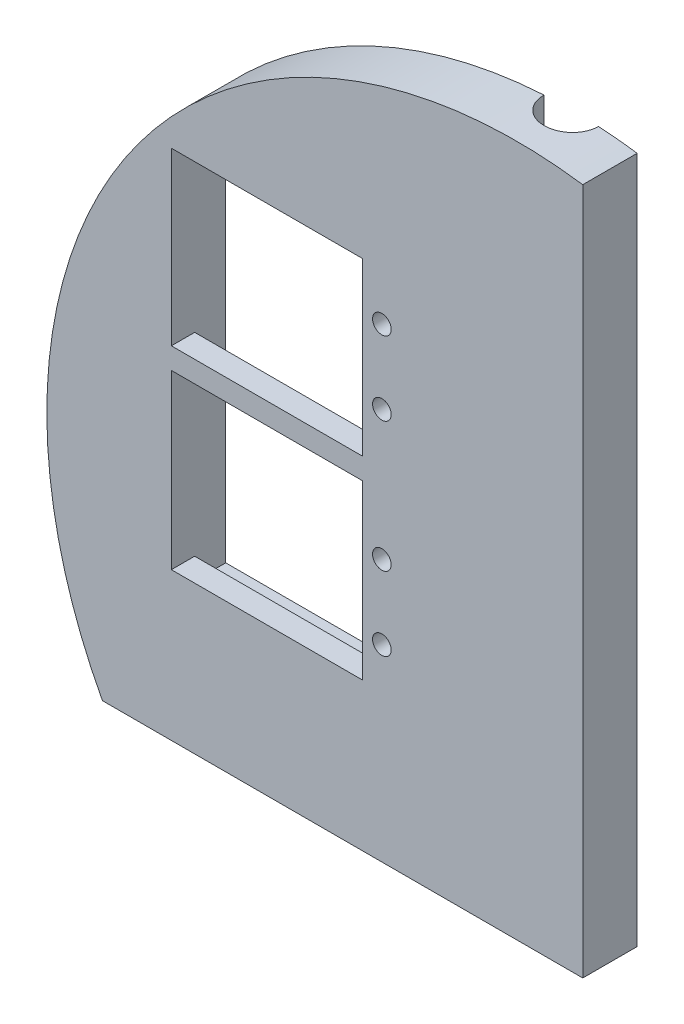
ISO-10303-21;
HEADER;
FILE_DESCRIPTION(('STEP AP214'),'2;1');
FILE_NAME('part.step','',(''),(''),'','','');
FILE_SCHEMA(('AUTOMOTIVE_DESIGN { 1 0 10303 214 1 1 1 1 }'));
ENDSEC;
DATA;
#1=APPLICATION_CONTEXT('core data for automotive mechanical design processes');
#2=APPLICATION_PROTOCOL_DEFINITION('international standard','automotive_design',2000,#1);
#3=PRODUCT_CONTEXT('',#1,'mechanical');
#4=PRODUCT('Part','Part','',(#3));
#5=PRODUCT_RELATED_PRODUCT_CATEGORY('part','',(#4));
#6=PRODUCT_DEFINITION_FORMATION('','',#4);
#7=PRODUCT_DEFINITION_CONTEXT('part definition',#1,'design');
#8=PRODUCT_DEFINITION('design','',#6,#7);
#9=PRODUCT_DEFINITION_SHAPE('','',#8);
#10=(LENGTH_UNIT() NAMED_UNIT(*) SI_UNIT(.MILLI.,.METRE.));
#11=(NAMED_UNIT(*) PLANE_ANGLE_UNIT() SI_UNIT($,.RADIAN.));
#12=(NAMED_UNIT(*) SI_UNIT($,.STERADIAN.) SOLID_ANGLE_UNIT());
#13=UNCERTAINTY_MEASURE_WITH_UNIT(LENGTH_MEASURE(1.E-05),#10,'distance_accuracy_value','');
#14=(GEOMETRIC_REPRESENTATION_CONTEXT(3) GLOBAL_UNCERTAINTY_ASSIGNED_CONTEXT((#13)) GLOBAL_UNIT_ASSIGNED_CONTEXT((#10,
#11,#12)) REPRESENTATION_CONTEXT('',''));
#15=CARTESIAN_POINT('',(0.,0.,0.));
#16=DIRECTION('',(0.,0.,1.));
#17=DIRECTION('',(1.,0.,0.));
#18=AXIS2_PLACEMENT_3D('',#15,#16,#17);
#19=CARTESIAN_POINT('',(0.,0.,0.));
#20=DIRECTION('',(0.,0.,1.));
#21=DIRECTION('',(1.,0.,0.));
#22=AXIS2_PLACEMENT_3D('',#19,#20,#21);
#23=PLANE('',#22);
#24=DIRECTION('',(-1.,0.,0.));
#25=VECTOR('',#24,1.);
#26=CARTESIAN_POINT('',(0.,-17.2383494563795,0.));
#27=LINE('',#26,#25);
#28=CARTESIAN_POINT('',(4.49999999999929,-17.2383494563795,0.));
#29=VERTEX_POINT('',#28);
#30=CARTESIAN_POINT('',(2.50000000000061,-17.2383494563795,0.));
#31=VERTEX_POINT('',#30);
#32=EDGE_CURVE('E360',#29,#31,#27,.T.);
#33=ORIENTED_EDGE('',*,*,#32,.F.);
#34=DIRECTION('',(0.,1.,0.));
#35=VECTOR('',#34,1.);
#36=CARTESIAN_POINT('',(4.49999999999929,-17.2383494563795,0.));
#37=LINE('',#36,#35);
#38=CARTESIAN_POINT('',(4.49999999999929,-14.2383494563795,0.));
#39=VERTEX_POINT('',#38);
#40=EDGE_CURVE('E64',#29,#39,#37,.T.);
#41=ORIENTED_EDGE('',*,*,#40,.T.);
#42=DIRECTION('',(-1.,0.,0.));
#43=VECTOR('',#42,1.);
#44=CARTESIAN_POINT('',(0.,-14.2383494563795,0.));
#45=LINE('',#44,#43);
#46=CARTESIAN_POINT('',(2.50000000000061,-14.2383494563795,0.));
#47=VERTEX_POINT('',#46);
#48=EDGE_CURVE('E353',#39,#47,#45,.T.);
#49=ORIENTED_EDGE('',*,*,#48,.T.);
#50=DIRECTION('',(0.,1.,0.));
#51=VECTOR('',#50,1.);
#52=CARTESIAN_POINT('',(2.50000000000061,-22.5,0.));
#53=LINE('',#52,#51);
#54=CARTESIAN_POINT('',(2.50000000000061,-9.50000000000001,0.));
#55=VERTEX_POINT('',#54);
#56=EDGE_CURVE('E388',#47,#55,#53,.T.);
#57=ORIENTED_EDGE('',*,*,#56,.T.);
#58=DIRECTION('',(-1.,0.,0.));
#59=VECTOR('',#58,1.);
#60=CARTESIAN_POINT('',(0.,-9.50000000000001,0.));
#61=LINE('',#60,#59);
#62=CARTESIAN_POINT('',(3.50000000003442,-9.50000000000001,0.));
#63=VERTEX_POINT('',#62);
#64=EDGE_CURVE('E283',#63,#55,#61,.T.);
#65=ORIENTED_EDGE('',*,*,#64,.F.);
#66=DIRECTION('',(0.,1.,0.));
#67=VECTOR('',#66,1.);
#68=CARTESIAN_POINT('',(3.50000000003442,-9.50000000000001,0.));
#69=LINE('',#68,#67);
#70=CARTESIAN_POINT('',(3.50000000003442,60.398675482164,0.));
#71=VERTEX_POINT('',#70);
#72=EDGE_CURVE('E299',#63,#71,#69,.T.);
#73=ORIENTED_EDGE('',*,*,#72,.T.);
#74=CARTESIAN_POINT('',(0.,0.,0.));
#75=DIRECTION('',(0.,0.,1.));
#76=DIRECTION('',(1.,0.,0.));
#77=AXIS2_PLACEMENT_3D('',#74,#75,#76);
#78=CIRCLE('',#77,60.5);
#79=CARTESIAN_POINT('',(8.48784603441241,59.9016399583193,0.));
#80=VERTEX_POINT('',#79);
#81=EDGE_CURVE('E277',#80,#71,#78,.T.);
#82=ORIENTED_EDGE('',*,*,#81,.F.);
#83=DIRECTION('',(0.,-1.,0.));
#84=VECTOR('',#83,1.);
#85=CARTESIAN_POINT('',(8.48784603441242,0.,0.));
#86=LINE('',#85,#84);
#87=CARTESIAN_POINT('',(8.48784603441242,-28.5421058613369,0.));
#88=VERTEX_POINT('',#87);
#89=EDGE_CURVE('E301',#80,#88,#86,.T.);
#90=ORIENTED_EDGE('',*,*,#89,.T.);
#91=DIRECTION('',(-1.,0.,0.));
#92=VECTOR('',#91,1.);
#93=CARTESIAN_POINT('',(0.,-28.5421058613369,0.));
#94=LINE('',#93,#92);
#95=CARTESIAN_POINT('',(-53.3441486294443,-28.5421058613369,0.));
#96=VERTEX_POINT('',#95);
#97=EDGE_CURVE('E304',#88,#96,#94,.T.);
#98=ORIENTED_EDGE('',*,*,#97,.T.);
#99=CARTESIAN_POINT('',(-3.49999999996558,60.398675482168,0.));
#100=VERTEX_POINT('',#99);
#101=EDGE_CURVE('E289',#100,#96,#78,.T.);
#102=ORIENTED_EDGE('',*,*,#101,.F.);
#103=DIRECTION('',(0.,1.,0.));
#104=VECTOR('',#103,1.);
#105=CARTESIAN_POINT('',(-3.49999999996558,-9.50000000000001,0.));
#106=LINE('',#105,#104);
#107=CARTESIAN_POINT('',(-3.49999999996558,37.4902757720887,0.));
#108=VERTEX_POINT('',#107);
#109=EDGE_CURVE('E294',#100,#108,#106,.F.);
#110=ORIENTED_EDGE('',*,*,#109,.T.);
#111=DIRECTION('',(1.,0.,0.));
#112=VECTOR('',#111,1.);
#113=CARTESIAN_POINT('',(-2.,37.4902757720887,0.));
#114=LINE('',#113,#112);
#115=CARTESIAN_POINT('',(-44.4723778560623,37.4902757720887,0.));
#116=VERTEX_POINT('',#115);
#117=EDGE_CURVE('E506',#116,#108,#114,.T.);
#118=ORIENTED_EDGE('',*,*,#117,.F.);
#119=DIRECTION('',(0.,1.,0.));
#120=VECTOR('',#119,1.);
#121=CARTESIAN_POINT('',(-44.4723778560623,37.4902757720887,0.));
#122=LINE('',#121,#120);
#123=CARTESIAN_POINT('',(-44.4723778560623,-12.2383494563795,0.));
#124=VERTEX_POINT('',#123);
#125=EDGE_CURVE('E492',#124,#116,#122,.T.);
#126=ORIENTED_EDGE('',*,*,#125,.F.);
#127=DIRECTION('',(-1.,0.,0.));
#128=VECTOR('',#127,1.);
#129=CARTESIAN_POINT('',(-44.4723778560623,-12.2383494563795,0.));
#130=LINE('',#129,#128);
#131=CARTESIAN_POINT('',(-2.50000000000045,-12.2383494563795,0.));
#132=VERTEX_POINT('',#131);
#133=EDGE_CURVE('E511',#132,#124,#130,.T.);
#134=ORIENTED_EDGE('',*,*,#133,.F.);
#135=DIRECTION('',(0.,1.,0.));
#136=VECTOR('',#135,1.);
#137=CARTESIAN_POINT('',(-2.50000000000045,-22.5,0.));
#138=LINE('',#137,#136);
#139=CARTESIAN_POINT('',(-2.50000000000045,-14.2383494563795,0.));
#140=VERTEX_POINT('',#139);
#141=EDGE_CURVE('E226',#132,#140,#138,.F.);
#142=ORIENTED_EDGE('',*,*,#141,.T.);
#143=CARTESIAN_POINT('',(-4.50000000000002,-14.2383494563795,0.));
#144=VERTEX_POINT('',#143);
#145=EDGE_CURVE('E73',#140,#144,#45,.T.);
#146=ORIENTED_EDGE('',*,*,#145,.T.);
#147=DIRECTION('',(0.,1.,0.));
#148=VECTOR('',#147,1.);
#149=CARTESIAN_POINT('',(-4.50000000000002,-17.2383494563795,0.));
#150=LINE('',#149,#148);
#151=CARTESIAN_POINT('',(-4.50000000000002,-17.2383494563795,0.));
#152=VERTEX_POINT('',#151);
#153=EDGE_CURVE('E350',#144,#152,#150,.F.);
#154=ORIENTED_EDGE('',*,*,#153,.T.);
#155=CARTESIAN_POINT('',(-2.50000000000045,-17.2383494563795,0.));
#156=VERTEX_POINT('',#155);
#157=EDGE_CURVE('E368',#156,#152,#27,.T.);
#158=ORIENTED_EDGE('',*,*,#157,.F.);
#159=CARTESIAN_POINT('',(-2.50000000000045,-22.5,0.));
#160=VERTEX_POINT('',#159);
#161=EDGE_CURVE('E381',#156,#160,#138,.F.);
#162=ORIENTED_EDGE('',*,*,#161,.T.);
#163=DIRECTION('',(-1.,0.,0.));
#164=VECTOR('',#163,1.);
#165=CARTESIAN_POINT('',(0.,-22.5,0.));
#166=LINE('',#165,#164);
#167=CARTESIAN_POINT('',(2.50000000000061,-22.5,0.));
#168=VERTEX_POINT('',#167);
#169=EDGE_CURVE('E227',#168,#160,#166,.T.);
#170=ORIENTED_EDGE('',*,*,#169,.F.);
#171=EDGE_CURVE('E387',#168,#31,#53,.T.);
#172=ORIENTED_EDGE('',*,*,#171,.T.);
#173=EDGE_LOOP('',(#33,#41,#49,#57,#65,#73,#82,#90,#98,#102,#110,#118,#126,#134,#142,#146,#154,
#158,#162,#170,#172));
#174=FACE_BOUND('',#173,.T.);
#175=ADVANCED_FACE('F51',(#174),#23,.F.);
#176=CARTESIAN_POINT('',(0.,-22.5,0.));
#177=DIRECTION('',(0.,1.,0.));
#178=DIRECTION('',(0.,0.,1.));
#179=AXIS2_PLACEMENT_3D('',#176,#177,#178);
#180=CYLINDRICAL_SURFACE('',#179,2.50000000000053);
#181=CARTESIAN_POINT('',(0.,-17.2383494563795,0.));
#182=DIRECTION('',(0.,1.,0.));
#183=DIRECTION('',(0.,0.,1.));
#184=AXIS2_PLACEMENT_3D('',#181,#182,#183);
#185=CIRCLE('',#184,2.50000000000053);
#186=EDGE_CURVE('E342',#31,#156,#185,.F.);
#187=ORIENTED_EDGE('',*,*,#186,.F.);
#188=ORIENTED_EDGE('',*,*,#171,.F.);
#189=CARTESIAN_POINT('',(0.,-22.5,0.));
#190=DIRECTION('',(0.,1.,0.));
#191=DIRECTION('',(0.,0.,1.));
#192=AXIS2_PLACEMENT_3D('',#189,#190,#191);
#193=CIRCLE('',#192,2.50000000000053);
#194=EDGE_CURVE('E378',#160,#168,#193,.T.);
#195=ORIENTED_EDGE('',*,*,#194,.F.);
#196=ORIENTED_EDGE('',*,*,#161,.F.);
#197=EDGE_LOOP('',(#187,#188,#195,#196));
#198=FACE_BOUND('',#197,.T.);
#199=ADVANCED_FACE('F250',(#198),#180,.F.);
#200=CARTESIAN_POINT('',(0.,0.,4.));
#201=DIRECTION('',(0.,0.,1.));
#202=DIRECTION('',(1.,0.,0.));
#203=AXIS2_PLACEMENT_3D('',#200,#201,#202);
#204=PLANE('',#203);
#205=CARTESIAN_POINT('',(-17.373644116037,-4.3075310000471,4.));
#206=DIRECTION('',(0.,0.,-1.));
#207=DIRECTION('',(-1.,0.,0.));
#208=AXIS2_PLACEMENT_3D('',#205,#206,#207);
#209=CIRCLE('',#208,2.2);
#210=CARTESIAN_POINT('',(-19.573644116037,-4.3075310000471,4.));
#211=VERTEX_POINT('',#210);
#212=EDGE_CURVE('E436',#211,#211,#209,.T.);
#213=ORIENTED_EDGE('',*,*,#212,.F.);
#214=EDGE_LOOP('',(#213));
#215=FACE_BOUND('',#214,.T.);
#216=CARTESIAN_POINT('',(-17.3776969994148,5.19246813543373,4.));
#217=DIRECTION('',(0.,0.,-1.));
#218=DIRECTION('',(-1.,0.,0.));
#219=AXIS2_PLACEMENT_3D('',#216,#217,#218);
#220=CIRCLE('',#219,2.2);
#221=CARTESIAN_POINT('',(-19.5776969994148,5.19246813543373,4.));
#222=VERTEX_POINT('',#221);
#223=EDGE_CURVE('E446',#222,#222,#220,.T.);
#224=ORIENTED_EDGE('',*,*,#223,.F.);
#225=EDGE_LOOP('',(#224));
#226=FACE_BOUND('',#225,.T.);
#227=CARTESIAN_POINT('',(-17.371512218157,21.9269050735277,4.));
#228=DIRECTION('',(0.,0.,-1.));
#229=DIRECTION('',(-1.,0.,0.));
#230=AXIS2_PLACEMENT_3D('',#227,#228,#229);
#231=CIRCLE('',#230,2.2);
#232=CARTESIAN_POINT('',(-19.571512218157,21.9269050735277,4.));
#233=VERTEX_POINT('',#232);
#234=EDGE_CURVE('E464',#233,#233,#231,.T.);
#235=ORIENTED_EDGE('',*,*,#234,.F.);
#236=EDGE_LOOP('',(#235));
#237=FACE_BOUND('',#236,.T.);
#238=CARTESIAN_POINT('',(-17.371512218157,31.4269050735276,4.));
#239=DIRECTION('',(0.,0.,-1.));
#240=DIRECTION('',(-1.,0.,0.));
#241=AXIS2_PLACEMENT_3D('',#238,#239,#240);
#242=CIRCLE('',#241,2.2);
#243=CARTESIAN_POINT('',(-19.571512218157,31.4269050735276,4.));
#244=VERTEX_POINT('',#243);
#245=EDGE_CURVE('E475',#244,#244,#242,.T.);
#246=ORIENTED_EDGE('',*,*,#245,.F.);
#247=EDGE_LOOP('',(#246));
#248=FACE_BOUND('',#247,.T.);
#249=DIRECTION('',(0.,-1.,0.));
#250=VECTOR('',#249,1.);
#251=CARTESIAN_POINT('',(-19.8820759993379,15.4563544375841,4.));
#252=LINE('',#251,#250);
#253=CARTESIAN_POINT('',(-19.8820759993379,37.4902757720887,4.));
#254=VERTEX_POINT('',#253);
#255=CARTESIAN_POINT('',(-19.8820759993379,15.4563544375841,4.));
#256=VERTEX_POINT('',#255);
#257=EDGE_CURVE('E393',#254,#256,#252,.T.);
#258=ORIENTED_EDGE('',*,*,#257,.F.);
#259=DIRECTION('',(1.,0.,0.));
#260=VECTOR('',#259,1.);
#261=CARTESIAN_POINT('',(-2.,37.4902757720887,4.));
#262=LINE('',#261,#260);
#263=CARTESIAN_POINT('',(-1.,37.4902757720887,4.));
#264=VERTEX_POINT('',#263);
#265=EDGE_CURVE('E497',#254,#264,#262,.T.);
#266=ORIENTED_EDGE('',*,*,#265,.T.);
#267=DIRECTION('',(0.,1.,0.));
#268=VECTOR('',#267,1.);
#269=CARTESIAN_POINT('',(-1.,37.4902757720887,4.));
#270=LINE('',#269,#268);
#271=CARTESIAN_POINT('',(-1.,-12.2383494563795,4.));
#272=VERTEX_POINT('',#271);
#273=EDGE_CURVE('E218',#272,#264,#270,.T.);
#274=ORIENTED_EDGE('',*,*,#273,.F.);
#275=DIRECTION('',(-1.,0.,0.));
#276=VECTOR('',#275,1.);
#277=CARTESIAN_POINT('',(-44.4723778560623,-12.2383494563795,4.));
#278=LINE('',#277,#276);
#279=CARTESIAN_POINT('',(-44.4723778560623,-12.2383494563795,4.));
#280=VERTEX_POINT('',#279);
#281=EDGE_CURVE('E212',#272,#280,#278,.T.);
#282=ORIENTED_EDGE('',*,*,#281,.T.);
#283=DIRECTION('',(0.,1.,0.));
#284=VECTOR('',#283,1.);
#285=CARTESIAN_POINT('',(-44.4723778560623,37.4902757720887,4.));
#286=LINE('',#285,#284);
#287=CARTESIAN_POINT('',(-44.4723778560623,-9.500807520189,4.));
#288=VERTEX_POINT('',#287);
#289=EDGE_CURVE('E494',#280,#288,#286,.T.);
#290=ORIENTED_EDGE('',*,*,#289,.T.);
#291=DIRECTION('',(-1.,0.,0.));
#292=VECTOR('',#291,1.);
#293=CARTESIAN_POINT('',(-44.4723778560623,-9.500807520189,4.));
#294=LINE('',#293,#292);
#295=CARTESIAN_POINT('',(-19.8715107920174,-9.500807520189,4.));
#296=VERTEX_POINT('',#295);
#297=EDGE_CURVE('E427',#296,#288,#294,.T.);
#298=ORIENTED_EDGE('',*,*,#297,.F.);
#299=DIRECTION('',(0.000475599259911524,-0.999999886902666,0.));
#300=VECTOR('',#299,1.);
#301=CARTESIAN_POINT('',(-19.8715107920174,-9.500807520189,4.));
#302=LINE('',#301,#300);
#303=CARTESIAN_POINT('',(-19.8820759993379,12.7137058656536,4.));
#304=VERTEX_POINT('',#303);
#305=EDGE_CURVE('E400',#304,#296,#302,.T.);
#306=ORIENTED_EDGE('',*,*,#305,.F.);
#307=DIRECTION('',(1.,0.,0.));
#308=VECTOR('',#307,1.);
#309=CARTESIAN_POINT('',(-19.8820759993379,12.7137058656536,4.));
#310=LINE('',#309,#308);
#311=CARTESIAN_POINT('',(-44.4723778560623,12.7137058656536,4.));
#312=VERTEX_POINT('',#311);
#313=EDGE_CURVE('E416',#312,#304,#310,.T.);
#314=ORIENTED_EDGE('',*,*,#313,.F.);
#315=CARTESIAN_POINT('',(-44.4723778560623,15.4563544375841,4.));
#316=VERTEX_POINT('',#315);
#317=EDGE_CURVE('E499',#312,#316,#286,.T.);
#318=ORIENTED_EDGE('',*,*,#317,.T.);
#319=DIRECTION('',(-1.,0.,0.));
#320=VECTOR('',#319,1.);
#321=CARTESIAN_POINT('',(-44.4723778560623,15.4563544375841,4.));
#322=LINE('',#321,#320);
#323=EDGE_CURVE('E399',#256,#316,#322,.T.);
#324=ORIENTED_EDGE('',*,*,#323,.F.);
#325=EDGE_LOOP('',(#258,#266,#274,#282,#290,#298,#306,#314,#318,#324));
#326=FACE_BOUND('',#325,.T.);
#327=ADVANCED_FACE('F252',(#215,#226,#237,#248,#326),#204,.F.);
#328=CARTESIAN_POINT('',(0.,0.,7.));
#329=DIRECTION('',(0.,0.,-1.));
#330=DIRECTION('',(-1.,0.,0.));
#331=AXIS2_PLACEMENT_3D('',#328,#329,#330);
#332=CYLINDRICAL_SURFACE('',#331,60.5);
#333=ORIENTED_EDGE('',*,*,#101,.T.);
#334=DIRECTION('',(0.,0.,1.));
#335=VECTOR('',#334,1.);
#336=CARTESIAN_POINT('',(-53.3441486294443,-28.5421058613369,-3.));
#337=LINE('',#336,#335);
#338=CARTESIAN_POINT('',(-53.3441486294443,-28.5421058613369,7.));
#339=VERTEX_POINT('',#338);
#340=EDGE_CURVE('E528',#96,#339,#337,.T.);
#341=ORIENTED_EDGE('',*,*,#340,.T.);
#342=CARTESIAN_POINT('',(0.,0.,7.));
#343=DIRECTION('',(0.,0.,1.));
#344=DIRECTION('',(1.,0.,0.));
#345=AXIS2_PLACEMENT_3D('',#342,#343,#344);
#346=CIRCLE('',#345,60.5);
#347=CARTESIAN_POINT('',(8.48784603441241,59.9016399583193,7.));
#348=VERTEX_POINT('',#347);
#349=EDGE_CURVE('E282',#348,#339,#346,.T.);
#350=ORIENTED_EDGE('',*,*,#349,.F.);
#351=DIRECTION('',(0.,0.,1.));
#352=VECTOR('',#351,1.);
#353=CARTESIAN_POINT('',(8.48784603441241,59.9016399583193,-3.));
#354=LINE('',#353,#352);
#355=EDGE_CURVE('E527',#80,#348,#354,.T.);
#356=ORIENTED_EDGE('',*,*,#355,.F.);
#357=ORIENTED_EDGE('',*,*,#81,.T.);
#358=CARTESIAN_POINT('',(3.50000000003442,60.398675482164,0.));
#359=CARTESIAN_POINT('',(3.50000952693264,60.398673138297,0.0983527657712839));
#360=CARTESIAN_POINT('',(3.49585435544842,60.3989156684955,0.196700946772377));
#361=CARTESIAN_POINT('',(3.47928835721452,60.3998731671281,0.392692080631501));
#362=CARTESIAN_POINT('',(3.46687797670895,60.4005881100253,0.490335071320959));
#363=CARTESIAN_POINT('',(3.43388790216585,60.4024724071079,0.684156432208212));
#364=CARTESIAN_POINT('',(3.41331446072073,60.4036414134836,0.780335865023678));
#365=CARTESIAN_POINT('',(3.36416643400679,60.4063985365345,0.970593237529522));
#366=CARTESIAN_POINT('',(3.33559193558346,60.4079866486607,1.06467120001783));
#367=CARTESIAN_POINT('',(3.23810185102494,60.4133180889932,1.34284085923981));
#368=CARTESIAN_POINT('',(3.1574052385381,60.4176293982524,1.52295268028292));
#369=CARTESIAN_POINT('',(2.96702667085545,60.4272767162173,1.86693430382375));
#370=CARTESIAN_POINT('',(2.85735094592784,60.4326125046013,2.03080758707166));
#371=CARTESIAN_POINT('',(2.61196050746828,60.4437153357395,2.33801745158537));
#372=CARTESIAN_POINT('',(2.47622057303447,60.4494827928702,2.48133390454184));
#373=CARTESIAN_POINT('',(2.18255455108583,60.4607972262713,2.74320572601958));
#374=CARTESIAN_POINT('',(2.02462004625511,60.4663441178633,2.86175165767552));
#375=CARTESIAN_POINT('',(1.69090577353212,60.4765964279645,3.07077461339094));
#376=CARTESIAN_POINT('',(1.51510667155134,60.4813009192443,3.16122078755021));
#377=CARTESIAN_POINT('',(1.15092283784931,60.4893248003223,3.31120432193968));
#378=CARTESIAN_POINT('',(0.962553025279566,60.492645799313,3.3707776113962));
#379=CARTESIAN_POINT('',(0.644288181579025,60.4967019541037,3.44263116568296));
#380=CARTESIAN_POINT('',(0.516401641595087,60.4979329159732,3.46411532160443));
#381=CARTESIAN_POINT('',(0.25902882531931,60.4995823791425,3.49280264476635));
#382=CARTESIAN_POINT('',(0.129542517910183,60.5000008646136,3.50000553377854));
#383=CARTESIAN_POINT('',(-0.196434361794498,60.499998688926,3.49999160871993));
#384=CARTESIAN_POINT('',(-0.392997972742864,60.4990331337587,3.48340833321626));
#385=CARTESIAN_POINT('',(-0.780686296161684,60.4952744408766,3.41749489503516));
#386=CARTESIAN_POINT('',(-0.971804905162376,60.4924793304404,3.36812938401568));
#387=CARTESIAN_POINT('',(-1.34294965048072,60.4853777813022,3.23807310842924));
#388=CARTESIAN_POINT('',(-1.52298119779414,60.4810720868172,3.15739776715231));
#389=CARTESIAN_POINT('',(-1.86690578488376,60.4714337418408,2.9670341447194));
#390=CARTESIAN_POINT('',(-2.03080200623368,60.4661012944206,2.85735159900897));
#391=CARTESIAN_POINT('',(-2.3380516509251,60.4550015695797,2.61193699903912));
#392=CARTESIAN_POINT('',(-2.48138205153041,60.4492338156978,2.47617614238439));
#393=CARTESIAN_POINT('',(-2.74324146471149,60.4379173176108,2.18250490616198));
#394=CARTESIAN_POINT('',(-2.86176851670297,60.4323685907469,2.02459277729046));
#395=CARTESIAN_POINT('',(-3.07074255460529,60.4221113116321,1.69095730965756));
#396=CARTESIAN_POINT('',(-3.16116341180633,60.41740354289,1.51521759768625));
#397=CARTESIAN_POINT('',(-3.31116694122077,60.4093689032918,1.15104192639792));
#398=CARTESIAN_POINT('',(-3.37076580943649,60.4060413073798,0.962612693986242));
#399=CARTESIAN_POINT('',(-3.44265166587481,60.4019781480782,0.64419250817945));
#400=CARTESIAN_POINT('',(-3.4641441997656,60.4007455211632,0.51621028974263));
#401=CARTESIAN_POINT('',(-3.4928164942286,60.3990918062692,0.258836723195604));
#402=CARTESIAN_POINT('',(-3.50001706709792,60.3986695382559,0.12944770040098));
#403=CARTESIAN_POINT('',(-3.49999999996558,60.398675482168,0.));
#404=B_SPLINE_CURVE_WITH_KNOTS('',3,(#358,#359,#360,#361,#362,#363,#364,#365,#366,#367,#368,
#369,#370,#371,#372,#373,#374,#375,#376,#377,#378,#379,#380,#381,#382,#383,#384,#385,#386,#387,
#388,#389,#390,#391,#392,#393,#394,#395,#396,#397,#398,#399,#400,#401,#402,#403),.UNSPECIFIED.,
.F.,.F.,(4,2,2,2,2,2,2,2,2,2,2,2,2,2,2,2,2,2,2,2,2,2,4),(0.,0.29496201421359,0.589908085236844,
0.884628673632343,1.17934606317985,1.76852732561746,2.35758202190403,2.9472096129301,
3.53706142741172,4.12755855300559,4.71736691819767,5.10567576950155,5.49399218578099,
6.0828234717304,6.67229071430916,7.26146795186213,7.85052878140971,8.4402439839181,
9.030005782957,9.62031422105357,10.2103121543329,10.5989067229187,10.9869349943643),.UNSPECIFIED.);
#405=EDGE_CURVE('E269',#71,#100,#404,.T.);
#406=ORIENTED_EDGE('',*,*,#405,.T.);
#407=EDGE_LOOP('',(#333,#341,#350,#356,#357,#406));
#408=FACE_BOUND('',#407,.T.);
#409=ADVANCED_FACE('F52',(#408),#332,.T.);
#410=CARTESIAN_POINT('',(0.,0.,7.));
#411=DIRECTION('',(0.,0.,1.));
#412=DIRECTION('',(1.,0.,0.));
#413=AXIS2_PLACEMENT_3D('',#410,#411,#412);
#414=PLANE('',#413);
#415=DIRECTION('',(0.,-1.,0.));
#416=VECTOR('',#415,1.);
#417=CARTESIAN_POINT('',(-44.4723778560623,0.,7.));
#418=LINE('',#417,#416);
#419=CARTESIAN_POINT('',(-44.4723778560623,37.4902757720887,7.));
#420=VERTEX_POINT('',#419);
#421=CARTESIAN_POINT('',(-44.4723778560623,15.4563544375841,7.));
#422=VERTEX_POINT('',#421);
#423=EDGE_CURVE('E228',#420,#422,#418,.T.);
#424=ORIENTED_EDGE('',*,*,#423,.F.);
#425=DIRECTION('',(-1.,0.,0.));
#426=VECTOR('',#425,1.);
#427=CARTESIAN_POINT('',(0.,37.4902757720887,7.));
#428=LINE('',#427,#426);
#429=CARTESIAN_POINT('',(-19.8820759993379,37.4902757720887,7.));
#430=VERTEX_POINT('',#429);
#431=EDGE_CURVE('E323',#430,#420,#428,.T.);
#432=ORIENTED_EDGE('',*,*,#431,.F.);
#433=DIRECTION('',(0.,1.,0.));
#434=VECTOR('',#433,1.);
#435=CARTESIAN_POINT('',(-19.8820759993379,0.,7.));
#436=LINE('',#435,#434);
#437=CARTESIAN_POINT('',(-19.8820759993379,15.4563544375841,7.));
#438=VERTEX_POINT('',#437);
#439=EDGE_CURVE('E328',#438,#430,#436,.T.);
#440=ORIENTED_EDGE('',*,*,#439,.F.);
#441=DIRECTION('',(1.,0.,0.));
#442=VECTOR('',#441,1.);
#443=CARTESIAN_POINT('',(0.,15.4563544375841,7.));
#444=LINE('',#443,#442);
#445=EDGE_CURVE('E331',#422,#438,#444,.T.);
#446=ORIENTED_EDGE('',*,*,#445,.F.);
#447=EDGE_LOOP('',(#424,#432,#440,#446));
#448=FACE_BOUND('',#447,.T.);
#449=DIRECTION('',(-0.000475599259911524,0.999999886902666,0.));
#450=VECTOR('',#449,1.);
#451=CARTESIAN_POINT('',(-19.876024873702,-0.0094530237890275,7.));
#452=LINE('',#451,#450);
#453=CARTESIAN_POINT('',(-19.8715107920174,-9.500807520189,7.));
#454=VERTEX_POINT('',#453);
#455=CARTESIAN_POINT('',(-19.8820759993379,12.7137058656536,7.));
#456=VERTEX_POINT('',#455);
#457=EDGE_CURVE('E408',#454,#456,#452,.T.);
#458=ORIENTED_EDGE('',*,*,#457,.F.);
#459=DIRECTION('',(1.,0.,0.));
#460=VECTOR('',#459,1.);
#461=CARTESIAN_POINT('',(0.,-9.500807520189,7.));
#462=LINE('',#461,#460);
#463=CARTESIAN_POINT('',(-44.4723778560623,-9.500807520189,7.));
#464=VERTEX_POINT('',#463);
#465=EDGE_CURVE('E312',#464,#454,#462,.T.);
#466=ORIENTED_EDGE('',*,*,#465,.F.);
#467=DIRECTION('',(0.,-1.,0.));
#468=VECTOR('',#467,1.);
#469=CARTESIAN_POINT('',(-44.4723778560623,0.,7.));
#470=LINE('',#469,#468);
#471=CARTESIAN_POINT('',(-44.4723778560623,12.7137058656536,7.));
#472=VERTEX_POINT('',#471);
#473=EDGE_CURVE('E319',#472,#464,#470,.T.);
#474=ORIENTED_EDGE('',*,*,#473,.F.);
#475=DIRECTION('',(-1.,0.,0.));
#476=VECTOR('',#475,1.);
#477=CARTESIAN_POINT('',(0.,12.7137058656536,7.));
#478=LINE('',#477,#476);
#479=EDGE_CURVE('E324',#456,#472,#478,.T.);
#480=ORIENTED_EDGE('',*,*,#479,.F.);
#481=EDGE_LOOP('',(#458,#466,#474,#480));
#482=FACE_BOUND('',#481,.T.);
#483=CARTESIAN_POINT('',(-17.373644116037,-4.3075310000471,7.));
#484=DIRECTION('',(0.,0.,-1.));
#485=DIRECTION('',(-1.,0.,0.));
#486=AXIS2_PLACEMENT_3D('',#483,#484,#485);
#487=CIRCLE('',#486,1.2);
#488=CARTESIAN_POINT('',(-18.573644116037,-4.3075310000471,7.));
#489=VERTEX_POINT('',#488);
#490=EDGE_CURVE('E445',#489,#489,#487,.T.);
#491=ORIENTED_EDGE('',*,*,#490,.T.);
#492=EDGE_LOOP('',(#491));
#493=FACE_BOUND('',#492,.T.);
#494=CARTESIAN_POINT('',(-17.3776969994148,5.19246813543373,7.));
#495=DIRECTION('',(0.,0.,-1.));
#496=DIRECTION('',(-1.,0.,0.));
#497=AXIS2_PLACEMENT_3D('',#494,#495,#496);
#498=CIRCLE('',#497,1.2);
#499=CARTESIAN_POINT('',(-18.5776969994148,5.19246813543373,7.));
#500=VERTEX_POINT('',#499);
#501=EDGE_CURVE('E460',#500,#500,#498,.T.);
#502=ORIENTED_EDGE('',*,*,#501,.T.);
#503=EDGE_LOOP('',(#502));
#504=FACE_BOUND('',#503,.T.);
#505=CARTESIAN_POINT('',(-17.371512218157,21.9269050735277,7.));
#506=DIRECTION('',(0.,0.,-1.));
#507=DIRECTION('',(-1.,0.,0.));
#508=AXIS2_PLACEMENT_3D('',#505,#506,#507);
#509=CIRCLE('',#508,1.2);
#510=CARTESIAN_POINT('',(-18.571512218157,21.9269050735277,7.));
#511=VERTEX_POINT('',#510);
#512=EDGE_CURVE('E468',#511,#511,#509,.T.);
#513=ORIENTED_EDGE('',*,*,#512,.T.);
#514=EDGE_LOOP('',(#513));
#515=FACE_BOUND('',#514,.T.);
#516=CARTESIAN_POINT('',(-17.371512218157,31.4269050735276,7.));
#517=DIRECTION('',(0.,0.,-1.));
#518=DIRECTION('',(-1.,0.,0.));
#519=AXIS2_PLACEMENT_3D('',#516,#517,#518);
#520=CIRCLE('',#519,1.2);
#521=CARTESIAN_POINT('',(-18.571512218157,31.4269050735276,7.));
#522=VERTEX_POINT('',#521);
#523=EDGE_CURVE('E220',#522,#522,#520,.T.);
#524=ORIENTED_EDGE('',*,*,#523,.T.);
#525=EDGE_LOOP('',(#524));
#526=FACE_BOUND('',#525,.T.);
#527=DIRECTION('',(0.,-1.,0.));
#528=VECTOR('',#527,1.);
#529=CARTESIAN_POINT('',(8.48784603441241,59.9016399583193,7.));
#530=LINE('',#529,#528);
#531=CARTESIAN_POINT('',(8.48784603441242,-28.5421058613369,7.));
#532=VERTEX_POINT('',#531);
#533=EDGE_CURVE('E518',#348,#532,#530,.T.);
#534=ORIENTED_EDGE('',*,*,#533,.F.);
#535=ORIENTED_EDGE('',*,*,#349,.T.);
#536=DIRECTION('',(-1.,0.,0.));
#537=VECTOR('',#536,1.);
#538=CARTESIAN_POINT('',(8.48784603441242,-28.5421058613369,7.));
#539=LINE('',#538,#537);
#540=EDGE_CURVE('E523',#532,#339,#539,.T.);
#541=ORIENTED_EDGE('',*,*,#540,.F.);
#542=EDGE_LOOP('',(#534,#535,#541));
#543=FACE_BOUND('',#542,.T.);
#544=ADVANCED_FACE('F256',(#448,#482,#493,#504,#515,#526,#543),#414,.T.);
#545=CARTESIAN_POINT('',(3.44169137633799E-11,-9.50000000000001,-1.01030295240889E-11));
#546=DIRECTION('',(0.,1.,0.));
#547=DIRECTION('',(0.,0.,1.));
#548=AXIS2_PLACEMENT_3D('',#545,#546,#547);
#549=CYLINDRICAL_SURFACE('',#548,3.5);
#550=DIRECTION('',(0.,1.,0.));
#551=VECTOR('',#550,1.);
#552=CARTESIAN_POINT('',(-1.,-9.50000000000001,3.35410196622932));
#553=LINE('',#552,#551);
#554=CARTESIAN_POINT('',(-1.,-9.50000000000001,3.35410196622932));
#555=VERTEX_POINT('',#554);
#556=CARTESIAN_POINT('',(-1.,37.4902757720887,3.35410196622932));
#557=VERTEX_POINT('',#556);
#558=EDGE_CURVE('E487',#555,#557,#553,.T.);
#559=ORIENTED_EDGE('',*,*,#558,.T.);
#560=CARTESIAN_POINT('',(3.44169137633799E-11,37.4902757720887,-1.01030295240889E-11));
#561=DIRECTION('',(0.,1.,0.));
#562=DIRECTION('',(0.,0.,1.));
#563=AXIS2_PLACEMENT_3D('',#560,#561,#562);
#564=CIRCLE('',#563,3.5);
#565=EDGE_CURVE('E309',#557,#108,#564,.F.);
#566=ORIENTED_EDGE('',*,*,#565,.T.);
#567=ORIENTED_EDGE('',*,*,#109,.F.);
#568=ORIENTED_EDGE('',*,*,#405,.F.);
#569=ORIENTED_EDGE('',*,*,#72,.F.);
#570=CARTESIAN_POINT('',(3.44169137633799E-11,-9.50000000000001,-1.01030295240889E-11));
#571=DIRECTION('',(0.,1.,0.));
#572=DIRECTION('',(0.,0.,1.));
#573=AXIS2_PLACEMENT_3D('',#570,#571,#572);
#574=CIRCLE('',#573,3.5);
#575=EDGE_CURVE('E278',#555,#63,#574,.T.);
#576=ORIENTED_EDGE('',*,*,#575,.F.);
#577=EDGE_LOOP('',(#559,#566,#567,#568,#569,#576));
#578=FACE_BOUND('',#577,.T.);
#579=ADVANCED_FACE('F263',(#578),#549,.F.);
#580=CARTESIAN_POINT('',(3.44169137633799E-11,-9.50000000000001,-1.01030295240889E-11));
#581=DIRECTION('',(0.,1.,0.));
#582=DIRECTION('',(0.,0.,1.));
#583=AXIS2_PLACEMENT_3D('',#580,#581,#582);
#584=PLANE('',#583);
#585=CARTESIAN_POINT('',(0.,-9.50000000000001,0.));
#586=DIRECTION('',(0.,1.,0.));
#587=DIRECTION('',(0.,0.,1.));
#588=AXIS2_PLACEMENT_3D('',#585,#586,#587);
#589=CIRCLE('',#588,2.50000000000053);
#590=CARTESIAN_POINT('',(-1.,-9.50000000000001,2.29128784747847));
#591=VERTEX_POINT('',#590);
#592=EDGE_CURVE('E384',#591,#55,#589,.T.);
#593=ORIENTED_EDGE('',*,*,#592,.F.);
#594=DIRECTION('',(0.,0.,-1.));
#595=VECTOR('',#594,1.);
#596=CARTESIAN_POINT('',(-1.,-9.50000000000001,-1.01030295240889E-11));
#597=LINE('',#596,#595);
#598=EDGE_CURVE('E67',#555,#591,#597,.T.);
#599=ORIENTED_EDGE('',*,*,#598,.F.);
#600=ORIENTED_EDGE('',*,*,#575,.T.);
#601=ORIENTED_EDGE('',*,*,#64,.T.);
#602=EDGE_LOOP('',(#593,#599,#600,#601));
#603=FACE_BOUND('',#602,.T.);
#604=ADVANCED_FACE('F266',(#603),#584,.T.);
#605=CARTESIAN_POINT('',(8.48784603441242,-28.5421058613369,-3.));
#606=DIRECTION('',(0.,1.,0.));
#607=DIRECTION('',(-1.,0.,0.));
#608=AXIS2_PLACEMENT_3D('',#605,#606,#607);
#609=PLANE('',#608);
#610=DIRECTION('',(0.,0.,1.));
#611=VECTOR('',#610,1.);
#612=CARTESIAN_POINT('',(8.48784603441242,-28.5421058613369,-3.));
#613=LINE('',#612,#611);
#614=EDGE_CURVE('E531',#88,#532,#613,.T.);
#615=ORIENTED_EDGE('',*,*,#614,.T.);
#616=ORIENTED_EDGE('',*,*,#540,.T.);
#617=ORIENTED_EDGE('',*,*,#340,.F.);
#618=ORIENTED_EDGE('',*,*,#97,.F.);
#619=EDGE_LOOP('',(#615,#616,#617,#618));
#620=FACE_BOUND('',#619,.T.);
#621=ADVANCED_FACE('F550',(#620),#609,.F.);
#622=CARTESIAN_POINT('',(8.48784603441241,59.9016399583193,-3.));
#623=DIRECTION('',(-1.,0.,0.));
#624=DIRECTION('',(0.,-1.,0.));
#625=AXIS2_PLACEMENT_3D('',#622,#623,#624);
#626=PLANE('',#625);
#627=ORIENTED_EDGE('',*,*,#355,.T.);
#628=ORIENTED_EDGE('',*,*,#533,.T.);
#629=ORIENTED_EDGE('',*,*,#614,.F.);
#630=ORIENTED_EDGE('',*,*,#89,.F.);
#631=EDGE_LOOP('',(#627,#628,#629,#630));
#632=FACE_BOUND('',#631,.T.);
#633=ADVANCED_FACE('F538',(#632),#626,.F.);
#634=CARTESIAN_POINT('',(-2.,37.4902757720887,4.));
#635=DIRECTION('',(0.,1.,0.));
#636=DIRECTION('',(0.,0.,1.));
#637=AXIS2_PLACEMENT_3D('',#634,#635,#636);
#638=PLANE('',#637);
#639=ORIENTED_EDGE('',*,*,#565,.F.);
#640=DIRECTION('',(0.,0.,-1.));
#641=VECTOR('',#640,1.);
#642=CARTESIAN_POINT('',(-1.,37.4902757720887,2.87228132323495));
#643=LINE('',#642,#641);
#644=EDGE_CURVE('E488',#264,#557,#643,.T.);
#645=ORIENTED_EDGE('',*,*,#644,.F.);
#646=ORIENTED_EDGE('',*,*,#265,.F.);
#647=DIRECTION('',(0.,0.,-1.));
#648=VECTOR('',#647,1.);
#649=CARTESIAN_POINT('',(-19.8820759993379,37.4902757720887,14.));
#650=LINE('',#649,#648);
#651=EDGE_CURVE('E405',#430,#254,#650,.T.);
#652=ORIENTED_EDGE('',*,*,#651,.F.);
#653=ORIENTED_EDGE('',*,*,#431,.T.);
#654=DIRECTION('',(0.,0.,-1.));
#655=VECTOR('',#654,1.);
#656=CARTESIAN_POINT('',(-44.4723778560623,37.4902757720887,4.));
#657=LINE('',#656,#655);
#658=EDGE_CURVE('E504',#420,#116,#657,.T.);
#659=ORIENTED_EDGE('',*,*,#658,.T.);
#660=ORIENTED_EDGE('',*,*,#117,.T.);
#661=EDGE_LOOP('',(#639,#645,#646,#652,#653,#659,#660));
#662=FACE_BOUND('',#661,.T.);
#663=ADVANCED_FACE('F638',(#662),#638,.F.);
#664=CARTESIAN_POINT('',(-44.4723778560623,37.4902757720887,4.));
#665=DIRECTION('',(-1.,0.,0.));
#666=DIRECTION('',(0.,0.,1.));
#667=AXIS2_PLACEMENT_3D('',#664,#665,#666);
#668=PLANE('',#667);
#669=ORIENTED_EDGE('',*,*,#125,.T.);
#670=ORIENTED_EDGE('',*,*,#658,.F.);
#671=ORIENTED_EDGE('',*,*,#423,.T.);
#672=DIRECTION('',(0.,0.,-1.));
#673=VECTOR('',#672,1.);
#674=CARTESIAN_POINT('',(-44.4723778560623,15.4563544375841,14.));
#675=LINE('',#674,#673);
#676=EDGE_CURVE('E402',#422,#316,#675,.T.);
#677=ORIENTED_EDGE('',*,*,#676,.T.);
#678=ORIENTED_EDGE('',*,*,#317,.F.);
#679=DIRECTION('',(0.,0.,-1.));
#680=VECTOR('',#679,1.);
#681=CARTESIAN_POINT('',(-44.4723778560623,12.7137058656536,14.));
#682=LINE('',#681,#680);
#683=EDGE_CURVE('E419',#472,#312,#682,.T.);
#684=ORIENTED_EDGE('',*,*,#683,.F.);
#685=ORIENTED_EDGE('',*,*,#473,.T.);
#686=DIRECTION('',(0.,0.,-1.));
#687=VECTOR('',#686,1.);
#688=CARTESIAN_POINT('',(-44.4723778560623,-9.500807520189,14.));
#689=LINE('',#688,#687);
#690=EDGE_CURVE('E420',#464,#288,#689,.T.);
#691=ORIENTED_EDGE('',*,*,#690,.T.);
#692=ORIENTED_EDGE('',*,*,#289,.F.);
#693=DIRECTION('',(0.,0.,-1.));
#694=VECTOR('',#693,1.);
#695=CARTESIAN_POINT('',(-44.4723778560623,-12.2383494563795,4.));
#696=LINE('',#695,#694);
#697=EDGE_CURVE('E512',#280,#124,#696,.T.);
#698=ORIENTED_EDGE('',*,*,#697,.T.);
#699=EDGE_LOOP('',(#669,#670,#671,#677,#678,#684,#685,#691,#692,#698));
#700=FACE_BOUND('',#699,.T.);
#701=ADVANCED_FACE('F243',(#700),#668,.F.);
#702=CARTESIAN_POINT('',(-44.4723778560623,-12.2383494563795,4.));
#703=DIRECTION('',(0.,-1.,0.));
#704=DIRECTION('',(0.,0.,-1.));
#705=AXIS2_PLACEMENT_3D('',#702,#703,#704);
#706=PLANE('',#705);
#707=DIRECTION('',(0.,0.,1.));
#708=VECTOR('',#707,1.);
#709=CARTESIAN_POINT('',(-1.,-12.2383494563795,4.));
#710=LINE('',#709,#708);
#711=CARTESIAN_POINT('',(-1.,-12.2383494563795,2.29128784747847));
#712=VERTEX_POINT('',#711);
#713=EDGE_CURVE('E206',#712,#272,#710,.T.);
#714=ORIENTED_EDGE('',*,*,#713,.F.);
#715=CARTESIAN_POINT('',(0.,-12.2383494563795,0.));
#716=DIRECTION('',(0.,-1.,0.));
#717=DIRECTION('',(0.,0.,-1.));
#718=AXIS2_PLACEMENT_3D('',#715,#716,#717);
#719=CIRCLE('',#718,2.50000000000053);
#720=EDGE_CURVE('E211',#712,#132,#719,.T.);
#721=ORIENTED_EDGE('',*,*,#720,.T.);
#722=ORIENTED_EDGE('',*,*,#133,.T.);
#723=ORIENTED_EDGE('',*,*,#697,.F.);
#724=ORIENTED_EDGE('',*,*,#281,.F.);
#725=EDGE_LOOP('',(#714,#721,#722,#723,#724));
#726=FACE_BOUND('',#725,.T.);
#727=ADVANCED_FACE('F214',(#726),#706,.F.);
#728=CARTESIAN_POINT('',(-1.,0.,0.));
#729=DIRECTION('',(1.,0.,0.));
#730=DIRECTION('',(0.,0.,-1.));
#731=AXIS2_PLACEMENT_3D('',#728,#729,#730);
#732=PLANE('',#731);
#733=ORIENTED_EDGE('',*,*,#598,.T.);
#734=DIRECTION('',(0.,1.,0.));
#735=VECTOR('',#734,1.);
#736=CARTESIAN_POINT('',(-1.,-22.5,2.29128784747847));
#737=LINE('',#736,#735);
#738=EDGE_CURVE('E11',#591,#712,#737,.F.);
#739=ORIENTED_EDGE('',*,*,#738,.T.);
#740=ORIENTED_EDGE('',*,*,#713,.T.);
#741=ORIENTED_EDGE('',*,*,#273,.T.);
#742=ORIENTED_EDGE('',*,*,#644,.T.);
#743=ORIENTED_EDGE('',*,*,#558,.F.);
#744=EDGE_LOOP('',(#733,#739,#740,#741,#742,#743));
#745=FACE_BOUND('',#744,.T.);
#746=ADVANCED_FACE('F232',(#745),#732,.F.);
#747=CARTESIAN_POINT('',(-17.371512218157,31.4269050735276,4.));
#748=DIRECTION('',(0.,0.,-1.));
#749=DIRECTION('',(-1.,0.,0.));
#750=AXIS2_PLACEMENT_3D('',#747,#748,#749);
#751=CYLINDRICAL_SURFACE('',#750,1.2);
#752=ORIENTED_EDGE('',*,*,#523,.F.);
#753=EDGE_LOOP('',(#752));
#754=FACE_BOUND('',#753,.T.);
#755=CARTESIAN_POINT('',(-17.371512218157,31.4269050735276,5.));
#756=DIRECTION('',(0.,0.,-1.));
#757=DIRECTION('',(-1.,0.,0.));
#758=AXIS2_PLACEMENT_3D('',#755,#756,#757);
#759=CIRCLE('',#758,1.2);
#760=CARTESIAN_POINT('',(-18.571512218157,31.4269050735276,5.));
#761=VERTEX_POINT('',#760);
#762=EDGE_CURVE('E480',#761,#761,#759,.T.);
#763=ORIENTED_EDGE('',*,*,#762,.T.);
#764=EDGE_LOOP('',(#763));
#765=FACE_BOUND('',#764,.T.);
#766=ADVANCED_FACE('F231',(#754,#765),#751,.F.);
#767=CARTESIAN_POINT('',(-17.371512218157,31.4269050735276,4.));
#768=DIRECTION('',(0.,0.,-1.));
#769=DIRECTION('',(-1.,0.,0.));
#770=AXIS2_PLACEMENT_3D('',#767,#768,#769);
#771=CONICAL_SURFACE('',#770,2.2,0.785398163397448);
#772=ORIENTED_EDGE('',*,*,#762,.F.);
#773=EDGE_LOOP('',(#772));
#774=FACE_BOUND('',#773,.T.);
#775=ORIENTED_EDGE('',*,*,#245,.T.);
#776=EDGE_LOOP('',(#775));
#777=FACE_BOUND('',#776,.T.);
#778=ADVANCED_FACE('F237',(#774,#777),#771,.F.);
#779=CARTESIAN_POINT('',(-17.371512218157,21.9269050735277,4.));
#780=DIRECTION('',(0.,0.,-1.));
#781=DIRECTION('',(-1.,0.,0.));
#782=AXIS2_PLACEMENT_3D('',#779,#780,#781);
#783=CYLINDRICAL_SURFACE('',#782,1.2);
#784=ORIENTED_EDGE('',*,*,#512,.F.);
#785=EDGE_LOOP('',(#784));
#786=FACE_BOUND('',#785,.T.);
#787=CARTESIAN_POINT('',(-17.371512218157,21.9269050735277,5.));
#788=DIRECTION('',(0.,0.,-1.));
#789=DIRECTION('',(-1.,0.,0.));
#790=AXIS2_PLACEMENT_3D('',#787,#788,#789);
#791=CIRCLE('',#790,1.2);
#792=CARTESIAN_POINT('',(-18.571512218157,21.9269050735277,5.));
#793=VERTEX_POINT('',#792);
#794=EDGE_CURVE('E462',#793,#793,#791,.T.);
#795=ORIENTED_EDGE('',*,*,#794,.T.);
#796=EDGE_LOOP('',(#795));
#797=FACE_BOUND('',#796,.T.);
#798=ADVANCED_FACE('F615',(#786,#797),#783,.F.);
#799=CARTESIAN_POINT('',(-17.371512218157,21.9269050735277,4.));
#800=DIRECTION('',(0.,0.,-1.));
#801=DIRECTION('',(-1.,0.,0.));
#802=AXIS2_PLACEMENT_3D('',#799,#800,#801);
#803=CONICAL_SURFACE('',#802,2.2,0.785398163397448);
#804=ORIENTED_EDGE('',*,*,#794,.F.);
#805=EDGE_LOOP('',(#804));
#806=FACE_BOUND('',#805,.T.);
#807=ORIENTED_EDGE('',*,*,#234,.T.);
#808=EDGE_LOOP('',(#807));
#809=FACE_BOUND('',#808,.T.);
#810=ADVANCED_FACE('F609',(#806,#809),#803,.F.);
#811=CARTESIAN_POINT('',(-17.3776969994148,5.19246813543373,4.));
#812=DIRECTION('',(0.,0.,-1.));
#813=DIRECTION('',(-1.,0.,0.));
#814=AXIS2_PLACEMENT_3D('',#811,#812,#813);
#815=CYLINDRICAL_SURFACE('',#814,1.2);
#816=ORIENTED_EDGE('',*,*,#501,.F.);
#817=EDGE_LOOP('',(#816));
#818=FACE_BOUND('',#817,.T.);
#819=CARTESIAN_POINT('',(-17.3776969994148,5.19246813543373,5.));
#820=DIRECTION('',(0.,0.,-1.));
#821=DIRECTION('',(-1.,0.,0.));
#822=AXIS2_PLACEMENT_3D('',#819,#820,#821);
#823=CIRCLE('',#822,1.2);
#824=CARTESIAN_POINT('',(-18.5776969994148,5.19246813543373,5.));
#825=VERTEX_POINT('',#824);
#826=EDGE_CURVE('E452',#825,#825,#823,.T.);
#827=ORIENTED_EDGE('',*,*,#826,.T.);
#828=EDGE_LOOP('',(#827));
#829=FACE_BOUND('',#828,.T.);
#830=ADVANCED_FACE('F604',(#818,#829),#815,.F.);
#831=CARTESIAN_POINT('',(-17.3776969994148,5.19246813543373,4.));
#832=DIRECTION('',(0.,0.,-1.));
#833=DIRECTION('',(-1.,0.,0.));
#834=AXIS2_PLACEMENT_3D('',#831,#832,#833);
#835=CONICAL_SURFACE('',#834,2.2,0.785398163397448);
#836=ORIENTED_EDGE('',*,*,#826,.F.);
#837=EDGE_LOOP('',(#836));
#838=FACE_BOUND('',#837,.T.);
#839=ORIENTED_EDGE('',*,*,#223,.T.);
#840=EDGE_LOOP('',(#839));
#841=FACE_BOUND('',#840,.T.);
#842=ADVANCED_FACE('F601',(#838,#841),#835,.F.);
#843=CARTESIAN_POINT('',(-17.373644116037,-4.3075310000471,4.));
#844=DIRECTION('',(0.,0.,-1.));
#845=DIRECTION('',(-1.,0.,0.));
#846=AXIS2_PLACEMENT_3D('',#843,#844,#845);
#847=CYLINDRICAL_SURFACE('',#846,1.2);
#848=ORIENTED_EDGE('',*,*,#490,.F.);
#849=EDGE_LOOP('',(#848));
#850=FACE_BOUND('',#849,.T.);
#851=CARTESIAN_POINT('',(-17.373644116037,-4.3075310000471,5.));
#852=DIRECTION('',(0.,0.,-1.));
#853=DIRECTION('',(-1.,0.,0.));
#854=AXIS2_PLACEMENT_3D('',#851,#852,#853);
#855=CIRCLE('',#854,1.2);
#856=CARTESIAN_POINT('',(-18.573644116037,-4.3075310000471,5.));
#857=VERTEX_POINT('',#856);
#858=EDGE_CURVE('E441',#857,#857,#855,.T.);
#859=ORIENTED_EDGE('',*,*,#858,.T.);
#860=EDGE_LOOP('',(#859));
#861=FACE_BOUND('',#860,.T.);
#862=ADVANCED_FACE('F599',(#850,#861),#847,.F.);
#863=CARTESIAN_POINT('',(-17.373644116037,-4.3075310000471,4.));
#864=DIRECTION('',(0.,0.,-1.));
#865=DIRECTION('',(-1.,0.,0.));
#866=AXIS2_PLACEMENT_3D('',#863,#864,#865);
#867=CONICAL_SURFACE('',#866,2.2,0.785398163397448);
#868=ORIENTED_EDGE('',*,*,#858,.F.);
#869=EDGE_LOOP('',(#868));
#870=FACE_BOUND('',#869,.T.);
#871=ORIENTED_EDGE('',*,*,#212,.T.);
#872=EDGE_LOOP('',(#871));
#873=FACE_BOUND('',#872,.T.);
#874=ADVANCED_FACE('F586',(#870,#873),#867,.F.);
#875=CARTESIAN_POINT('',(-19.8715107920174,-9.500807520189,14.));
#876=DIRECTION('',(0.999999886902666,0.000475599259911524,0.));
#877=DIRECTION('',(-0.000475599259911524,0.999999886902666,0.));
#878=AXIS2_PLACEMENT_3D('',#875,#876,#877);
#879=PLANE('',#878);
#880=ORIENTED_EDGE('',*,*,#457,.T.);
#881=DIRECTION('',(0.,0.,-1.));
#882=VECTOR('',#881,1.);
#883=CARTESIAN_POINT('',(-19.8820759993379,12.7137058656536,14.));
#884=LINE('',#883,#882);
#885=EDGE_CURVE('E394',#456,#304,#884,.T.);
#886=ORIENTED_EDGE('',*,*,#885,.T.);
#887=ORIENTED_EDGE('',*,*,#305,.T.);
#888=DIRECTION('',(0.,0.,-1.));
#889=VECTOR('',#888,1.);
#890=CARTESIAN_POINT('',(-19.8715107920174,-9.500807520189,14.));
#891=LINE('',#890,#889);
#892=EDGE_CURVE('E411',#454,#296,#891,.T.);
#893=ORIENTED_EDGE('',*,*,#892,.F.);
#894=EDGE_LOOP('',(#880,#886,#887,#893));
#895=FACE_BOUND('',#894,.T.);
#896=ADVANCED_FACE('F584',(#895),#879,.F.);
#897=CARTESIAN_POINT('',(-19.8820759993379,12.7137058656536,14.));
#898=DIRECTION('',(0.,1.,0.));
#899=DIRECTION('',(-1.,0.,0.));
#900=AXIS2_PLACEMENT_3D('',#897,#898,#899);
#901=PLANE('',#900);
#902=ORIENTED_EDGE('',*,*,#479,.T.);
#903=ORIENTED_EDGE('',*,*,#683,.T.);
#904=ORIENTED_EDGE('',*,*,#313,.T.);
#905=ORIENTED_EDGE('',*,*,#885,.F.);
#906=EDGE_LOOP('',(#902,#903,#904,#905));
#907=FACE_BOUND('',#906,.T.);
#908=ADVANCED_FACE('F589',(#907),#901,.F.);
#909=CARTESIAN_POINT('',(-44.4723778560623,-9.500807520189,14.));
#910=DIRECTION('',(0.,-1.,0.));
#911=DIRECTION('',(0.,0.,-1.));
#912=AXIS2_PLACEMENT_3D('',#909,#910,#911);
#913=PLANE('',#912);
#914=ORIENTED_EDGE('',*,*,#465,.T.);
#915=ORIENTED_EDGE('',*,*,#892,.T.);
#916=ORIENTED_EDGE('',*,*,#297,.T.);
#917=ORIENTED_EDGE('',*,*,#690,.F.);
#918=EDGE_LOOP('',(#914,#915,#916,#917));
#919=FACE_BOUND('',#918,.T.);
#920=ADVANCED_FACE('F579',(#919),#913,.F.);
#921=CARTESIAN_POINT('',(-44.4723778560623,15.4563544375841,14.));
#922=DIRECTION('',(0.,-1.,0.));
#923=DIRECTION('',(0.,0.,-1.));
#924=AXIS2_PLACEMENT_3D('',#921,#922,#923);
#925=PLANE('',#924);
#926=ORIENTED_EDGE('',*,*,#445,.T.);
#927=DIRECTION('',(0.,0.,-1.));
#928=VECTOR('',#927,1.);
#929=CARTESIAN_POINT('',(-19.8820759993379,15.4563544375841,14.));
#930=LINE('',#929,#928);
#931=EDGE_CURVE('E407',#438,#256,#930,.T.);
#932=ORIENTED_EDGE('',*,*,#931,.T.);
#933=ORIENTED_EDGE('',*,*,#323,.T.);
#934=ORIENTED_EDGE('',*,*,#676,.F.);
#935=EDGE_LOOP('',(#926,#932,#933,#934));
#936=FACE_BOUND('',#935,.T.);
#937=ADVANCED_FACE('F573',(#936),#925,.F.);
#938=CARTESIAN_POINT('',(-19.8820759993379,15.4563544375841,14.));
#939=DIRECTION('',(1.,0.,0.));
#940=DIRECTION('',(0.,1.,0.));
#941=AXIS2_PLACEMENT_3D('',#938,#939,#940);
#942=PLANE('',#941);
#943=ORIENTED_EDGE('',*,*,#439,.T.);
#944=ORIENTED_EDGE('',*,*,#651,.T.);
#945=ORIENTED_EDGE('',*,*,#257,.T.);
#946=ORIENTED_EDGE('',*,*,#931,.F.);
#947=EDGE_LOOP('',(#943,#944,#945,#946));
#948=FACE_BOUND('',#947,.T.);
#949=ADVANCED_FACE('F570',(#948),#942,.F.);
#950=CARTESIAN_POINT('',(0.,-22.5,0.));
#951=DIRECTION('',(0.,1.,0.));
#952=DIRECTION('',(0.,0.,1.));
#953=AXIS2_PLACEMENT_3D('',#950,#951,#952);
#954=PLANE('',#953);
#955=ORIENTED_EDGE('',*,*,#169,.T.);
#956=ORIENTED_EDGE('',*,*,#194,.T.);
#957=EDGE_LOOP('',(#955,#956));
#958=FACE_BOUND('',#957,.T.);
#959=ADVANCED_FACE('F562',(#958),#954,.T.);
#960=ORIENTED_EDGE('',*,*,#720,.F.);
#961=ORIENTED_EDGE('',*,*,#738,.F.);
#962=ORIENTED_EDGE('',*,*,#592,.T.);
#963=ORIENTED_EDGE('',*,*,#56,.F.);
#964=CARTESIAN_POINT('',(0.,-14.2383494563795,0.));
#965=DIRECTION('',(0.,1.,0.));
#966=DIRECTION('',(0.,0.,1.));
#967=AXIS2_PLACEMENT_3D('',#964,#965,#966);
#968=CIRCLE('',#967,2.50000000000053);
#969=EDGE_CURVE('E341',#47,#140,#968,.F.);
#970=ORIENTED_EDGE('',*,*,#969,.T.);
#971=ORIENTED_EDGE('',*,*,#141,.F.);
#972=EDGE_LOOP('',(#960,#961,#962,#963,#970,#971));
#973=FACE_BOUND('',#972,.T.);
#974=ADVANCED_FACE('F225',(#973),#180,.F.);
#975=CARTESIAN_POINT('',(-3.66285675347081E-13,-17.2383494563795,-1.97932704739507E-13));
#976=DIRECTION('',(0.,1.,0.));
#977=DIRECTION('',(0.,0.,1.));
#978=AXIS2_PLACEMENT_3D('',#975,#976,#977);
#979=CYLINDRICAL_SURFACE('',#978,4.49999999999966);
#980=CARTESIAN_POINT('',(-3.66285675347081E-13,-17.2383494563795,-1.97932704739507E-13));
#981=DIRECTION('',(0.,1.,0.));
#982=DIRECTION('',(0.,0.,1.));
#983=AXIS2_PLACEMENT_3D('',#980,#981,#982);
#984=CIRCLE('',#983,4.49999999999966);
#985=EDGE_CURVE('E365',#152,#29,#984,.T.);
#986=ORIENTED_EDGE('',*,*,#985,.F.);
#987=ORIENTED_EDGE('',*,*,#153,.F.);
#988=CARTESIAN_POINT('',(-3.66285675347081E-13,-14.2383494563795,-1.97932704739507E-13));
#989=DIRECTION('',(0.,1.,0.));
#990=DIRECTION('',(0.,0.,1.));
#991=AXIS2_PLACEMENT_3D('',#988,#989,#990);
#992=CIRCLE('',#991,4.49999999999966);
#993=EDGE_CURVE('E363',#144,#39,#992,.T.);
#994=ORIENTED_EDGE('',*,*,#993,.T.);
#995=ORIENTED_EDGE('',*,*,#40,.F.);
#996=EDGE_LOOP('',(#986,#987,#994,#995));
#997=FACE_BOUND('',#996,.T.);
#998=ADVANCED_FACE('F361',(#997),#979,.F.);
#999=CARTESIAN_POINT('',(-3.66285675347081E-13,-17.2383494563795,-1.97932704739507E-13));
#1000=DIRECTION('',(0.,1.,0.));
#1001=DIRECTION('',(0.,0.,1.));
#1002=AXIS2_PLACEMENT_3D('',#999,#1000,#1001);
#1003=PLANE('',#1002);
#1004=ORIENTED_EDGE('',*,*,#32,.T.);
#1005=ORIENTED_EDGE('',*,*,#186,.T.);
#1006=ORIENTED_EDGE('',*,*,#157,.T.);
#1007=ORIENTED_EDGE('',*,*,#985,.T.);
#1008=EDGE_LOOP('',(#1004,#1005,#1006,#1007));
#1009=FACE_BOUND('',#1008,.T.);
#1010=ADVANCED_FACE('F366',(#1009),#1003,.T.);
#1011=CARTESIAN_POINT('',(-3.66285675347081E-13,-14.2383494563795,-1.97932704739507E-13));
#1012=DIRECTION('',(0.,1.,0.));
#1013=DIRECTION('',(0.,0.,1.));
#1014=AXIS2_PLACEMENT_3D('',#1011,#1012,#1013);
#1015=PLANE('',#1014);
#1016=ORIENTED_EDGE('',*,*,#993,.F.);
#1017=ORIENTED_EDGE('',*,*,#145,.F.);
#1018=ORIENTED_EDGE('',*,*,#969,.F.);
#1019=ORIENTED_EDGE('',*,*,#48,.F.);
#1020=EDGE_LOOP('',(#1016,#1017,#1018,#1019));
#1021=FACE_BOUND('',#1020,.T.);
#1022=ADVANCED_FACE('F659',(#1021),#1015,.F.);
#1023=CLOSED_SHELL('',(#175,#199,#327,#409,#544,#579,#604,#621,#633,#663,#701,#727,#746,#766,
#778,#798,#810,#830,#842,#862,#874,#896,#908,#920,#937,#949,#959,#974,#998,#1010,#1022));
#1024=MANIFOLD_SOLID_BREP('B2',#1023);
#1025=ADVANCED_BREP_SHAPE_REPRESENTATION('',(#18,#1024),#14);
#1026=SHAPE_DEFINITION_REPRESENTATION(#9,#1025);
ENDSEC;
END-ISO-10303-21;
